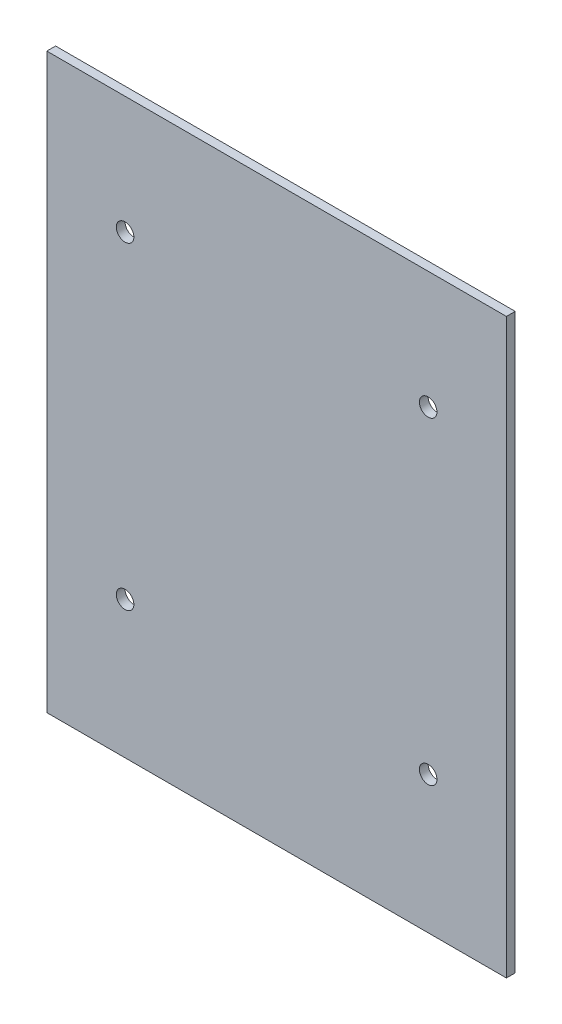
ISO-10303-21;
HEADER;
FILE_DESCRIPTION(('STEP AP214'),'2;1');
FILE_NAME('part.step','',(''),(''),'','','');
FILE_SCHEMA(('AUTOMOTIVE_DESIGN { 1 0 10303 214 1 1 1 1 }'));
ENDSEC;
DATA;
#1=APPLICATION_CONTEXT('core data for automotive mechanical design processes');
#2=APPLICATION_PROTOCOL_DEFINITION('international standard','automotive_design',2000,#1);
#3=PRODUCT_CONTEXT('',#1,'mechanical');
#4=PRODUCT('Part','Part','',(#3));
#5=PRODUCT_RELATED_PRODUCT_CATEGORY('part','',(#4));
#6=PRODUCT_DEFINITION_FORMATION('','',#4);
#7=PRODUCT_DEFINITION_CONTEXT('part definition',#1,'design');
#8=PRODUCT_DEFINITION('design','',#6,#7);
#9=PRODUCT_DEFINITION_SHAPE('','',#8);
#10=(LENGTH_UNIT() NAMED_UNIT(*) SI_UNIT(.MILLI.,.METRE.));
#11=(NAMED_UNIT(*) PLANE_ANGLE_UNIT() SI_UNIT($,.RADIAN.));
#12=(NAMED_UNIT(*) SI_UNIT($,.STERADIAN.) SOLID_ANGLE_UNIT());
#13=UNCERTAINTY_MEASURE_WITH_UNIT(LENGTH_MEASURE(1.E-05),#10,'distance_accuracy_value','');
#14=(GEOMETRIC_REPRESENTATION_CONTEXT(3) GLOBAL_UNCERTAINTY_ASSIGNED_CONTEXT((#13)) GLOBAL_UNIT_ASSIGNED_CONTEXT((#10,
#11,#12)) REPRESENTATION_CONTEXT('',''));
#15=CARTESIAN_POINT('',(0.,0.,0.));
#16=DIRECTION('',(0.,0.,1.));
#17=DIRECTION('',(1.,0.,0.));
#18=AXIS2_PLACEMENT_3D('',#15,#16,#17);
#19=CARTESIAN_POINT('',(0.,0.,3.175));
#20=DIRECTION('',(0.,0.,1.));
#21=DIRECTION('',(1.,0.,0.));
#22=AXIS2_PLACEMENT_3D('',#19,#20,#21);
#23=PLANE('',#22);
#24=CARTESIAN_POINT('',(28.287,-157.5,3.175));
#25=DIRECTION('',(0.,0.,1.));
#26=DIRECTION('',(-1.,0.,0.));
#27=AXIS2_PLACEMENT_3D('',#24,#25,#26);
#28=CIRCLE('',#27,3.175);
#29=CARTESIAN_POINT('',(25.112,-157.5,3.175));
#30=VERTEX_POINT('',#29);
#31=EDGE_CURVE('E142',#30,#30,#28,.T.);
#32=ORIENTED_EDGE('',*,*,#31,.F.);
#33=EDGE_LOOP('',(#32));
#34=FACE_BOUND('',#33,.T.);
#35=CARTESIAN_POINT('',(28.287,-42.5,3.175));
#36=DIRECTION('',(0.,0.,1.));
#37=DIRECTION('',(1.,0.,0.));
#38=AXIS2_PLACEMENT_3D('',#35,#36,#37);
#39=CIRCLE('',#38,3.17500000000001);
#40=CARTESIAN_POINT('',(31.462,-42.5,3.175));
#41=VERTEX_POINT('',#40);
#42=EDGE_CURVE('E112',#41,#41,#39,.T.);
#43=ORIENTED_EDGE('',*,*,#42,.F.);
#44=EDGE_LOOP('',(#43));
#45=FACE_BOUND('',#44,.T.);
#46=DIRECTION('',(0.,-1.,0.));
#47=VECTOR('',#46,1.);
#48=CARTESIAN_POINT('',(0.,0.,3.175));
#49=LINE('',#48,#47);
#50=CARTESIAN_POINT('',(0.,0.,3.175));
#51=VERTEX_POINT('',#50);
#52=CARTESIAN_POINT('',(0.,-207.09,3.175));
#53=VERTEX_POINT('',#52);
#54=EDGE_CURVE('E92',#51,#53,#49,.T.);
#55=ORIENTED_EDGE('',*,*,#54,.T.);
#56=DIRECTION('',(1.,0.,0.));
#57=VECTOR('',#56,1.);
#58=CARTESIAN_POINT('',(0.,-207.09,3.175));
#59=LINE('',#58,#57);
#60=CARTESIAN_POINT('',(166.124,-207.09,3.175));
#61=VERTEX_POINT('',#60);
#62=EDGE_CURVE('E87',#53,#61,#59,.T.);
#63=ORIENTED_EDGE('',*,*,#62,.T.);
#64=DIRECTION('',(0.,1.,0.));
#65=VECTOR('',#64,1.);
#66=CARTESIAN_POINT('',(166.124,0.,3.175));
#67=LINE('',#66,#65);
#68=CARTESIAN_POINT('',(166.124,0.,3.175));
#69=VERTEX_POINT('',#68);
#70=EDGE_CURVE('E90',#61,#69,#67,.T.);
#71=ORIENTED_EDGE('',*,*,#70,.T.);
#72=DIRECTION('',(-1.,0.,0.));
#73=VECTOR('',#72,1.);
#74=CARTESIAN_POINT('',(0.,0.,3.175));
#75=LINE('',#74,#73);
#76=EDGE_CURVE('E57',#69,#51,#75,.T.);
#77=ORIENTED_EDGE('',*,*,#76,.T.);
#78=EDGE_LOOP('',(#55,#63,#71,#77));
#79=FACE_BOUND('',#78,.T.);
#80=CARTESIAN_POINT('',(137.837,-42.5,3.175));
#81=DIRECTION('',(0.,0.,1.));
#82=DIRECTION('',(-1.,0.,0.));
#83=AXIS2_PLACEMENT_3D('',#80,#81,#82);
#84=CIRCLE('',#83,3.17499999999997);
#85=CARTESIAN_POINT('',(134.662,-42.5,3.175));
#86=VERTEX_POINT('',#85);
#87=EDGE_CURVE('E134',#86,#86,#84,.T.);
#88=ORIENTED_EDGE('',*,*,#87,.F.);
#89=EDGE_LOOP('',(#88));
#90=FACE_BOUND('',#89,.T.);
#91=CARTESIAN_POINT('',(137.837,-157.5,3.175));
#92=DIRECTION('',(0.,0.,1.));
#93=DIRECTION('',(1.,0.,0.));
#94=AXIS2_PLACEMENT_3D('',#91,#92,#93);
#95=CIRCLE('',#94,3.17499999999997);
#96=CARTESIAN_POINT('',(141.012,-157.5,3.175));
#97=VERTEX_POINT('',#96);
#98=EDGE_CURVE('E150',#97,#97,#95,.T.);
#99=ORIENTED_EDGE('',*,*,#98,.F.);
#100=EDGE_LOOP('',(#99));
#101=FACE_BOUND('',#100,.T.);
#102=ADVANCED_FACE('F39',(#34,#45,#79,#90,#101),#23,.T.);
#103=CARTESIAN_POINT('',(0.,0.,0.));
#104=DIRECTION('',(0.,0.,1.));
#105=DIRECTION('',(1.,0.,0.));
#106=AXIS2_PLACEMENT_3D('',#103,#104,#105);
#107=PLANE('',#106);
#108=DIRECTION('',(0.,-1.,0.));
#109=VECTOR('',#108,1.);
#110=CARTESIAN_POINT('',(0.,0.,0.));
#111=LINE('',#110,#109);
#112=CARTESIAN_POINT('',(0.,0.,0.));
#113=VERTEX_POINT('',#112);
#114=CARTESIAN_POINT('',(0.,-207.09,0.));
#115=VERTEX_POINT('',#114);
#116=EDGE_CURVE('E108',#113,#115,#111,.T.);
#117=ORIENTED_EDGE('',*,*,#116,.F.);
#118=DIRECTION('',(-1.,0.,0.));
#119=VECTOR('',#118,1.);
#120=CARTESIAN_POINT('',(0.,0.,0.));
#121=LINE('',#120,#119);
#122=CARTESIAN_POINT('',(166.124,0.,0.));
#123=VERTEX_POINT('',#122);
#124=EDGE_CURVE('E80',#123,#113,#121,.T.);
#125=ORIENTED_EDGE('',*,*,#124,.F.);
#126=DIRECTION('',(0.,1.,0.));
#127=VECTOR('',#126,1.);
#128=CARTESIAN_POINT('',(166.124,0.,0.));
#129=LINE('',#128,#127);
#130=CARTESIAN_POINT('',(166.124,-207.09,0.));
#131=VERTEX_POINT('',#130);
#132=EDGE_CURVE('E74',#131,#123,#129,.T.);
#133=ORIENTED_EDGE('',*,*,#132,.F.);
#134=DIRECTION('',(1.,0.,0.));
#135=VECTOR('',#134,1.);
#136=CARTESIAN_POINT('',(0.,-207.09,0.));
#137=LINE('',#136,#135);
#138=EDGE_CURVE('E97',#115,#131,#137,.T.);
#139=ORIENTED_EDGE('',*,*,#138,.F.);
#140=EDGE_LOOP('',(#117,#125,#133,#139));
#141=FACE_BOUND('',#140,.T.);
#142=CARTESIAN_POINT('',(28.287,-42.5,0.));
#143=DIRECTION('',(0.,0.,1.));
#144=DIRECTION('',(1.,0.,0.));
#145=AXIS2_PLACEMENT_3D('',#142,#143,#144);
#146=CIRCLE('',#145,3.17500000000001);
#147=CARTESIAN_POINT('',(31.462,-42.5,0.));
#148=VERTEX_POINT('',#147);
#149=EDGE_CURVE('E130',#148,#148,#146,.T.);
#150=ORIENTED_EDGE('',*,*,#149,.T.);
#151=EDGE_LOOP('',(#150));
#152=FACE_BOUND('',#151,.T.);
#153=CARTESIAN_POINT('',(137.837,-42.5,0.));
#154=DIRECTION('',(0.,0.,1.));
#155=DIRECTION('',(-1.,0.,0.));
#156=AXIS2_PLACEMENT_3D('',#153,#154,#155);
#157=CIRCLE('',#156,3.17499999999997);
#158=CARTESIAN_POINT('',(134.662,-42.5,0.));
#159=VERTEX_POINT('',#158);
#160=EDGE_CURVE('E138',#159,#159,#157,.T.);
#161=ORIENTED_EDGE('',*,*,#160,.T.);
#162=EDGE_LOOP('',(#161));
#163=FACE_BOUND('',#162,.T.);
#164=CARTESIAN_POINT('',(28.287,-157.5,0.));
#165=DIRECTION('',(0.,0.,1.));
#166=DIRECTION('',(-1.,0.,0.));
#167=AXIS2_PLACEMENT_3D('',#164,#165,#166);
#168=CIRCLE('',#167,3.175);
#169=CARTESIAN_POINT('',(25.112,-157.5,0.));
#170=VERTEX_POINT('',#169);
#171=EDGE_CURVE('E146',#170,#170,#168,.T.);
#172=ORIENTED_EDGE('',*,*,#171,.T.);
#173=EDGE_LOOP('',(#172));
#174=FACE_BOUND('',#173,.T.);
#175=CARTESIAN_POINT('',(137.837,-157.5,0.));
#176=DIRECTION('',(0.,0.,1.));
#177=DIRECTION('',(1.,0.,0.));
#178=AXIS2_PLACEMENT_3D('',#175,#176,#177);
#179=CIRCLE('',#178,3.17499999999997);
#180=CARTESIAN_POINT('',(141.012,-157.5,0.));
#181=VERTEX_POINT('',#180);
#182=EDGE_CURVE('E154',#181,#181,#179,.T.);
#183=ORIENTED_EDGE('',*,*,#182,.T.);
#184=EDGE_LOOP('',(#183));
#185=FACE_BOUND('',#184,.T.);
#186=ADVANCED_FACE('F125',(#141,#152,#163,#174,#185),#107,.F.);
#187=CARTESIAN_POINT('',(0.,0.,3.175));
#188=DIRECTION('',(1.,0.,0.));
#189=DIRECTION('',(0.,1.,0.));
#190=AXIS2_PLACEMENT_3D('',#187,#188,#189);
#191=PLANE('',#190);
#192=ORIENTED_EDGE('',*,*,#116,.T.);
#193=DIRECTION('',(0.,0.,-1.));
#194=VECTOR('',#193,1.);
#195=CARTESIAN_POINT('',(0.,-207.09,3.175));
#196=LINE('',#195,#194);
#197=EDGE_CURVE('E11',#53,#115,#196,.T.);
#198=ORIENTED_EDGE('',*,*,#197,.F.);
#199=ORIENTED_EDGE('',*,*,#54,.F.);
#200=DIRECTION('',(0.,0.,-1.));
#201=VECTOR('',#200,1.);
#202=CARTESIAN_POINT('',(0.,0.,3.175));
#203=LINE('',#202,#201);
#204=EDGE_CURVE('E104',#51,#113,#203,.T.);
#205=ORIENTED_EDGE('',*,*,#204,.T.);
#206=EDGE_LOOP('',(#192,#198,#199,#205));
#207=FACE_BOUND('',#206,.T.);
#208=ADVANCED_FACE('F41',(#207),#191,.F.);
#209=CARTESIAN_POINT('',(0.,-207.09,3.175));
#210=DIRECTION('',(0.,1.,0.));
#211=DIRECTION('',(0.,0.,1.));
#212=AXIS2_PLACEMENT_3D('',#209,#210,#211);
#213=PLANE('',#212);
#214=ORIENTED_EDGE('',*,*,#138,.T.);
#215=DIRECTION('',(0.,0.,-1.));
#216=VECTOR('',#215,1.);
#217=CARTESIAN_POINT('',(166.124,-207.09,3.175));
#218=LINE('',#217,#216);
#219=EDGE_CURVE('E49',#61,#131,#218,.T.);
#220=ORIENTED_EDGE('',*,*,#219,.F.);
#221=ORIENTED_EDGE('',*,*,#62,.F.);
#222=ORIENTED_EDGE('',*,*,#197,.T.);
#223=EDGE_LOOP('',(#214,#220,#221,#222));
#224=FACE_BOUND('',#223,.T.);
#225=ADVANCED_FACE('F96',(#224),#213,.F.);
#226=CARTESIAN_POINT('',(166.124,0.,3.175));
#227=DIRECTION('',(-1.,0.,0.));
#228=DIRECTION('',(0.,-1.,0.));
#229=AXIS2_PLACEMENT_3D('',#226,#227,#228);
#230=PLANE('',#229);
#231=ORIENTED_EDGE('',*,*,#132,.T.);
#232=DIRECTION('',(0.,0.,-1.));
#233=VECTOR('',#232,1.);
#234=CARTESIAN_POINT('',(166.124,0.,3.175));
#235=LINE('',#234,#233);
#236=EDGE_CURVE('E99',#69,#123,#235,.T.);
#237=ORIENTED_EDGE('',*,*,#236,.F.);
#238=ORIENTED_EDGE('',*,*,#70,.F.);
#239=ORIENTED_EDGE('',*,*,#219,.T.);
#240=EDGE_LOOP('',(#231,#237,#238,#239));
#241=FACE_BOUND('',#240,.T.);
#242=ADVANCED_FACE('F100',(#241),#230,.F.);
#243=CARTESIAN_POINT('',(0.,0.,3.175));
#244=DIRECTION('',(0.,-1.,0.));
#245=DIRECTION('',(0.,0.,-1.));
#246=AXIS2_PLACEMENT_3D('',#243,#244,#245);
#247=PLANE('',#246);
#248=ORIENTED_EDGE('',*,*,#124,.T.);
#249=ORIENTED_EDGE('',*,*,#204,.F.);
#250=ORIENTED_EDGE('',*,*,#76,.F.);
#251=ORIENTED_EDGE('',*,*,#236,.T.);
#252=EDGE_LOOP('',(#248,#249,#250,#251));
#253=FACE_BOUND('',#252,.T.);
#254=ADVANCED_FACE('F122',(#253),#247,.F.);
#255=CARTESIAN_POINT('',(28.287,-42.5,3.175));
#256=DIRECTION('',(0.,0.,-1.));
#257=DIRECTION('',(-1.,0.,0.));
#258=AXIS2_PLACEMENT_3D('',#255,#256,#257);
#259=CYLINDRICAL_SURFACE('',#258,3.17500000000001);
#260=ORIENTED_EDGE('',*,*,#42,.T.);
#261=EDGE_LOOP('',(#260));
#262=FACE_BOUND('',#261,.T.);
#263=ORIENTED_EDGE('',*,*,#149,.F.);
#264=EDGE_LOOP('',(#263));
#265=FACE_BOUND('',#264,.T.);
#266=ADVANCED_FACE('F175',(#262,#265),#259,.F.);
#267=CARTESIAN_POINT('',(137.837,-42.5,3.175));
#268=DIRECTION('',(0.,0.,-1.));
#269=DIRECTION('',(-1.,0.,0.));
#270=AXIS2_PLACEMENT_3D('',#267,#268,#269);
#271=CYLINDRICAL_SURFACE('',#270,3.17499999999997);
#272=ORIENTED_EDGE('',*,*,#87,.T.);
#273=EDGE_LOOP('',(#272));
#274=FACE_BOUND('',#273,.T.);
#275=ORIENTED_EDGE('',*,*,#160,.F.);
#276=EDGE_LOOP('',(#275));
#277=FACE_BOUND('',#276,.T.);
#278=ADVANCED_FACE('F221',(#274,#277),#271,.F.);
#279=CARTESIAN_POINT('',(28.287,-157.5,3.175));
#280=DIRECTION('',(0.,0.,-1.));
#281=DIRECTION('',(-1.,0.,0.));
#282=AXIS2_PLACEMENT_3D('',#279,#280,#281);
#283=CYLINDRICAL_SURFACE('',#282,3.175);
#284=ORIENTED_EDGE('',*,*,#31,.T.);
#285=EDGE_LOOP('',(#284));
#286=FACE_BOUND('',#285,.T.);
#287=ORIENTED_EDGE('',*,*,#171,.F.);
#288=EDGE_LOOP('',(#287));
#289=FACE_BOUND('',#288,.T.);
#290=ADVANCED_FACE('F229',(#286,#289),#283,.F.);
#291=CARTESIAN_POINT('',(137.837,-157.5,3.175));
#292=DIRECTION('',(0.,0.,-1.));
#293=DIRECTION('',(-1.,0.,0.));
#294=AXIS2_PLACEMENT_3D('',#291,#292,#293);
#295=CYLINDRICAL_SURFACE('',#294,3.17499999999997);
#296=ORIENTED_EDGE('',*,*,#98,.T.);
#297=EDGE_LOOP('',(#296));
#298=FACE_BOUND('',#297,.T.);
#299=ORIENTED_EDGE('',*,*,#182,.F.);
#300=EDGE_LOOP('',(#299));
#301=FACE_BOUND('',#300,.T.);
#302=ADVANCED_FACE('F162',(#298,#301),#295,.F.);
#303=CLOSED_SHELL('',(#102,#186,#208,#225,#242,#254,#266,#278,#290,#302));
#304=MANIFOLD_SOLID_BREP('B2',#303);
#305=ADVANCED_BREP_SHAPE_REPRESENTATION('',(#18,#304),#14);
#306=SHAPE_DEFINITION_REPRESENTATION(#9,#305);
ENDSEC;
END-ISO-10303-21;
